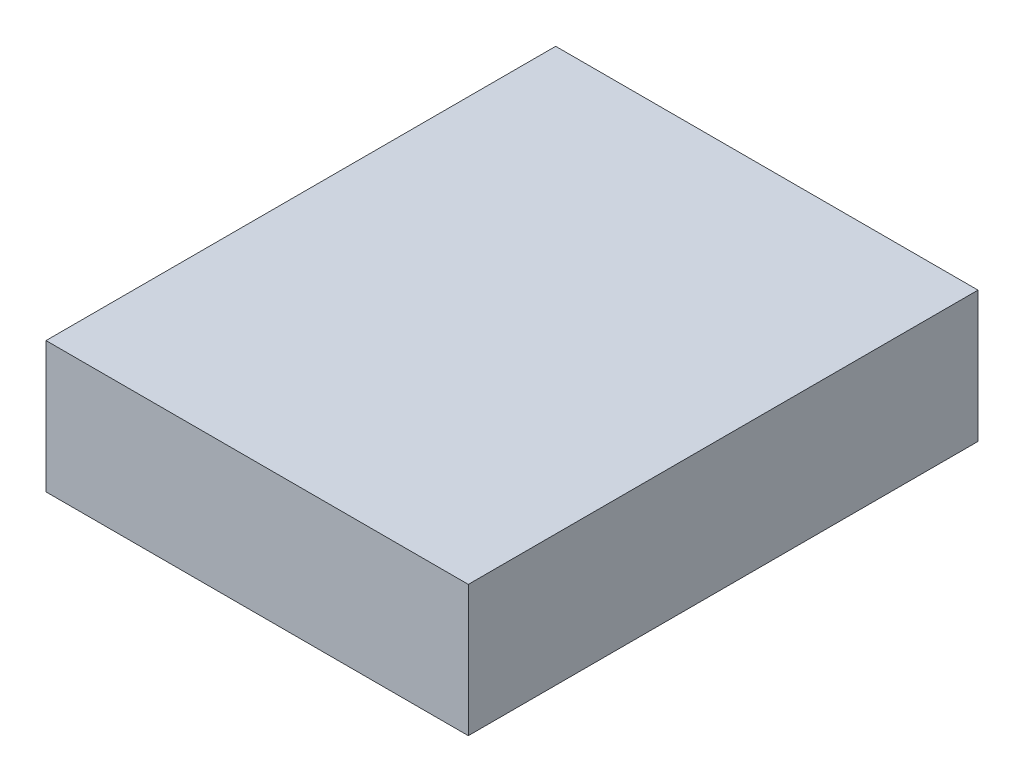
ISO-10303-21;
HEADER;
FILE_DESCRIPTION(('STEP AP214'),'2;1');
FILE_NAME('part.step','',(''),(''),'','','');
FILE_SCHEMA(('AUTOMOTIVE_DESIGN { 1 0 10303 214 1 1 1 1 }'));
ENDSEC;
DATA;
#1=APPLICATION_CONTEXT('core data for automotive mechanical design processes');
#2=APPLICATION_PROTOCOL_DEFINITION('international standard','automotive_design',2000,#1);
#3=PRODUCT_CONTEXT('',#1,'mechanical');
#4=PRODUCT('Part','Part','',(#3));
#5=PRODUCT_RELATED_PRODUCT_CATEGORY('part','',(#4));
#6=PRODUCT_DEFINITION_FORMATION('','',#4);
#7=PRODUCT_DEFINITION_CONTEXT('part definition',#1,'design');
#8=PRODUCT_DEFINITION('design','',#6,#7);
#9=PRODUCT_DEFINITION_SHAPE('','',#8);
#10=(LENGTH_UNIT() NAMED_UNIT(*) SI_UNIT(.MILLI.,.METRE.));
#11=(NAMED_UNIT(*) PLANE_ANGLE_UNIT() SI_UNIT($,.RADIAN.));
#12=(NAMED_UNIT(*) SI_UNIT($,.STERADIAN.) SOLID_ANGLE_UNIT());
#13=UNCERTAINTY_MEASURE_WITH_UNIT(LENGTH_MEASURE(1.E-05),#10,'distance_accuracy_value','');
#14=(GEOMETRIC_REPRESENTATION_CONTEXT(3) GLOBAL_UNCERTAINTY_ASSIGNED_CONTEXT((#13)) GLOBAL_UNIT_ASSIGNED_CONTEXT((#10,
#11,#12)) REPRESENTATION_CONTEXT('',''));
#15=CARTESIAN_POINT('',(0.,0.,0.));
#16=DIRECTION('',(0.,0.,1.));
#17=DIRECTION('',(1.,0.,0.));
#18=AXIS2_PLACEMENT_3D('',#15,#16,#17);
#19=CARTESIAN_POINT('',(29.,18.,-35.));
#20=DIRECTION('',(-1.,0.,0.));
#21=DIRECTION('',(0.,0.,1.));
#22=AXIS2_PLACEMENT_3D('',#19,#20,#21);
#23=PLANE('',#22);
#24=DIRECTION('',(0.,0.,-1.));
#25=VECTOR('',#24,1.);
#26=CARTESIAN_POINT('',(29.,0.,-35.));
#27=LINE('',#26,#25);
#28=CARTESIAN_POINT('',(29.,0.,35.));
#29=VERTEX_POINT('',#28);
#30=CARTESIAN_POINT('',(29.,0.,-35.));
#31=VERTEX_POINT('',#30);
#32=EDGE_CURVE('E98',#29,#31,#27,.T.);
#33=ORIENTED_EDGE('',*,*,#32,.T.);
#34=DIRECTION('',(0.,-1.,0.));
#35=VECTOR('',#34,1.);
#36=CARTESIAN_POINT('',(29.,18.,-35.));
#37=LINE('',#36,#35);
#38=CARTESIAN_POINT('',(29.,18.,-35.));
#39=VERTEX_POINT('',#38);
#40=EDGE_CURVE('E11',#39,#31,#37,.T.);
#41=ORIENTED_EDGE('',*,*,#40,.F.);
#42=DIRECTION('',(0.,0.,-1.));
#43=VECTOR('',#42,1.);
#44=CARTESIAN_POINT('',(29.,18.,-35.));
#45=LINE('',#44,#43);
#46=CARTESIAN_POINT('',(29.,18.,35.));
#47=VERTEX_POINT('',#46);
#48=EDGE_CURVE('E86',#47,#39,#45,.T.);
#49=ORIENTED_EDGE('',*,*,#48,.F.);
#50=DIRECTION('',(0.,-1.,0.));
#51=VECTOR('',#50,1.);
#52=CARTESIAN_POINT('',(29.,18.,35.));
#53=LINE('',#52,#51);
#54=EDGE_CURVE('E94',#47,#29,#53,.T.);
#55=ORIENTED_EDGE('',*,*,#54,.T.);
#56=EDGE_LOOP('',(#33,#41,#49,#55));
#57=FACE_BOUND('',#56,.T.);
#58=ADVANCED_FACE('F35',(#57),#23,.F.);
#59=CARTESIAN_POINT('',(-29.,18.,-35.));
#60=DIRECTION('',(0.,0.,1.));
#61=DIRECTION('',(1.,0.,0.));
#62=AXIS2_PLACEMENT_3D('',#59,#60,#61);
#63=PLANE('',#62);
#64=DIRECTION('',(-1.,0.,0.));
#65=VECTOR('',#64,1.);
#66=CARTESIAN_POINT('',(-29.,0.,-35.));
#67=LINE('',#66,#65);
#68=CARTESIAN_POINT('',(-29.,0.,-35.));
#69=VERTEX_POINT('',#68);
#70=EDGE_CURVE('E90',#31,#69,#67,.T.);
#71=ORIENTED_EDGE('',*,*,#70,.T.);
#72=DIRECTION('',(0.,-1.,0.));
#73=VECTOR('',#72,1.);
#74=CARTESIAN_POINT('',(-29.,18.,-35.));
#75=LINE('',#74,#73);
#76=CARTESIAN_POINT('',(-29.,18.,-35.));
#77=VERTEX_POINT('',#76);
#78=EDGE_CURVE('E43',#77,#69,#75,.T.);
#79=ORIENTED_EDGE('',*,*,#78,.F.);
#80=DIRECTION('',(-1.,0.,0.));
#81=VECTOR('',#80,1.);
#82=CARTESIAN_POINT('',(-29.,18.,-35.));
#83=LINE('',#82,#81);
#84=EDGE_CURVE('E81',#39,#77,#83,.T.);
#85=ORIENTED_EDGE('',*,*,#84,.F.);
#86=ORIENTED_EDGE('',*,*,#40,.T.);
#87=EDGE_LOOP('',(#71,#79,#85,#86));
#88=FACE_BOUND('',#87,.T.);
#89=ADVANCED_FACE('F89',(#88),#63,.F.);
#90=CARTESIAN_POINT('',(-29.,18.,-35.));
#91=DIRECTION('',(1.,0.,0.));
#92=DIRECTION('',(0.,0.,-1.));
#93=AXIS2_PLACEMENT_3D('',#90,#91,#92);
#94=PLANE('',#93);
#95=DIRECTION('',(0.,0.,1.));
#96=VECTOR('',#95,1.);
#97=CARTESIAN_POINT('',(-29.,0.,-35.));
#98=LINE('',#97,#96);
#99=CARTESIAN_POINT('',(-29.,0.,35.));
#100=VERTEX_POINT('',#99);
#101=EDGE_CURVE('E68',#69,#100,#98,.T.);
#102=ORIENTED_EDGE('',*,*,#101,.T.);
#103=DIRECTION('',(0.,-1.,0.));
#104=VECTOR('',#103,1.);
#105=CARTESIAN_POINT('',(-29.,18.,35.));
#106=LINE('',#105,#104);
#107=CARTESIAN_POINT('',(-29.,18.,35.));
#108=VERTEX_POINT('',#107);
#109=EDGE_CURVE('E91',#108,#100,#106,.T.);
#110=ORIENTED_EDGE('',*,*,#109,.F.);
#111=DIRECTION('',(0.,0.,1.));
#112=VECTOR('',#111,1.);
#113=CARTESIAN_POINT('',(-29.,18.,-35.));
#114=LINE('',#113,#112);
#115=EDGE_CURVE('E84',#77,#108,#114,.T.);
#116=ORIENTED_EDGE('',*,*,#115,.F.);
#117=ORIENTED_EDGE('',*,*,#78,.T.);
#118=EDGE_LOOP('',(#102,#110,#116,#117));
#119=FACE_BOUND('',#118,.T.);
#120=ADVANCED_FACE('F92',(#119),#94,.F.);
#121=CARTESIAN_POINT('',(-29.,18.,35.));
#122=DIRECTION('',(0.,0.,-1.));
#123=DIRECTION('',(-1.,0.,0.));
#124=AXIS2_PLACEMENT_3D('',#121,#122,#123);
#125=PLANE('',#124);
#126=DIRECTION('',(1.,0.,0.));
#127=VECTOR('',#126,1.);
#128=CARTESIAN_POINT('',(-29.,0.,35.));
#129=LINE('',#128,#127);
#130=EDGE_CURVE('E74',#100,#29,#129,.T.);
#131=ORIENTED_EDGE('',*,*,#130,.T.);
#132=ORIENTED_EDGE('',*,*,#54,.F.);
#133=DIRECTION('',(1.,0.,0.));
#134=VECTOR('',#133,1.);
#135=CARTESIAN_POINT('',(-29.,18.,35.));
#136=LINE('',#135,#134);
#137=EDGE_CURVE('E51',#108,#47,#136,.T.);
#138=ORIENTED_EDGE('',*,*,#137,.F.);
#139=ORIENTED_EDGE('',*,*,#109,.T.);
#140=EDGE_LOOP('',(#131,#132,#138,#139));
#141=FACE_BOUND('',#140,.T.);
#142=ADVANCED_FACE('F105',(#141),#125,.F.);
#143=CARTESIAN_POINT('',(0.,18.,0.));
#144=DIRECTION('',(0.,1.,0.));
#145=DIRECTION('',(0.,0.,1.));
#146=AXIS2_PLACEMENT_3D('',#143,#144,#145);
#147=PLANE('',#146);
#148=ORIENTED_EDGE('',*,*,#48,.T.);
#149=ORIENTED_EDGE('',*,*,#84,.T.);
#150=ORIENTED_EDGE('',*,*,#115,.T.);
#151=ORIENTED_EDGE('',*,*,#137,.T.);
#152=EDGE_LOOP('',(#148,#149,#150,#151));
#153=FACE_BOUND('',#152,.T.);
#154=ADVANCED_FACE('F82',(#153),#147,.T.);
#155=CARTESIAN_POINT('',(0.,0.,0.));
#156=DIRECTION('',(0.,1.,0.));
#157=DIRECTION('',(0.,0.,1.));
#158=AXIS2_PLACEMENT_3D('',#155,#156,#157);
#159=PLANE('',#158);
#160=ORIENTED_EDGE('',*,*,#32,.F.);
#161=ORIENTED_EDGE('',*,*,#130,.F.);
#162=ORIENTED_EDGE('',*,*,#101,.F.);
#163=ORIENTED_EDGE('',*,*,#70,.F.);
#164=EDGE_LOOP('',(#160,#161,#162,#163));
#165=FACE_BOUND('',#164,.T.);
#166=ADVANCED_FACE('F108',(#165),#159,.F.);
#167=CLOSED_SHELL('',(#58,#89,#120,#142,#154,#166));
#168=MANIFOLD_SOLID_BREP('B2',#167);
#169=ADVANCED_BREP_SHAPE_REPRESENTATION('',(#18,#168),#14);
#170=SHAPE_DEFINITION_REPRESENTATION(#9,#169);
ENDSEC;
END-ISO-10303-21;
